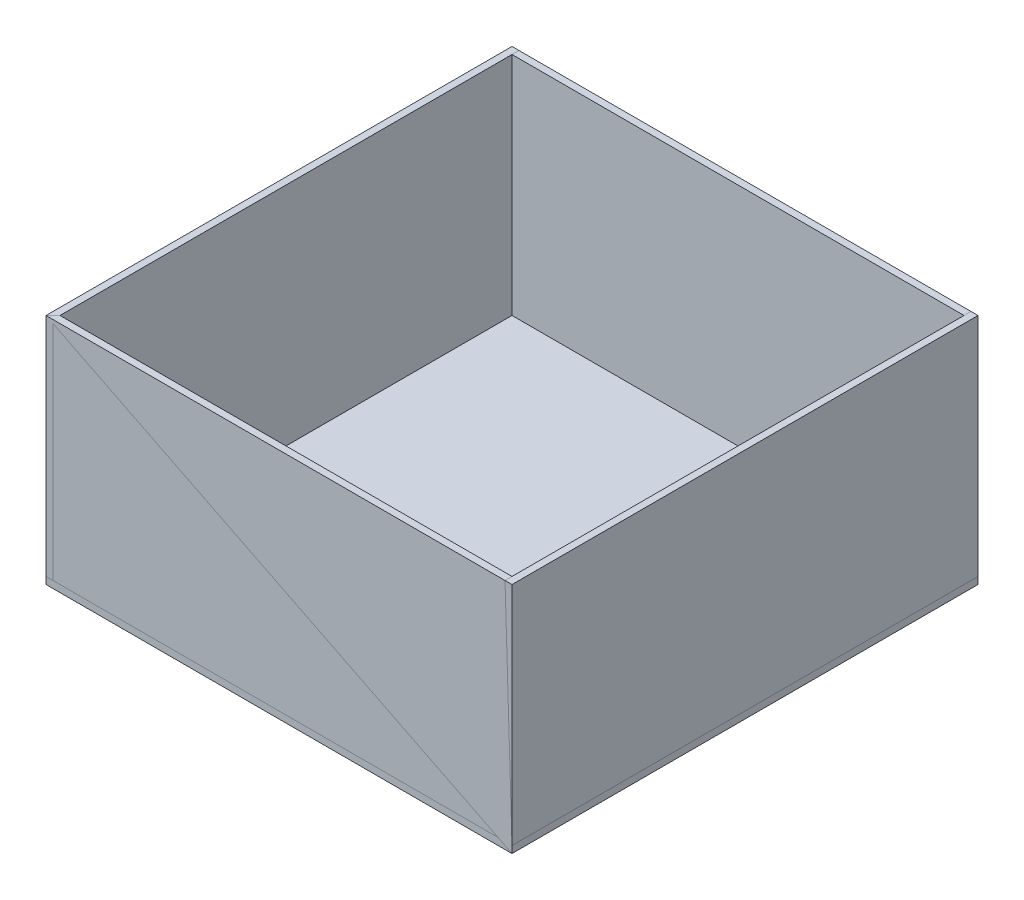
ISO-10303-21;
HEADER;
FILE_DESCRIPTION(('STEP AP214'),'2;1');
FILE_NAME('part.step','',(''),(''),'','','');
FILE_SCHEMA(('AUTOMOTIVE_DESIGN { 1 0 10303 214 1 1 1 1 }'));
ENDSEC;
DATA;
#1=APPLICATION_CONTEXT('core data for automotive mechanical design processes');
#2=APPLICATION_PROTOCOL_DEFINITION('international standard','automotive_design',2000,#1);
#3=PRODUCT_CONTEXT('',#1,'mechanical');
#4=PRODUCT('Part','Part','',(#3));
#5=PRODUCT_RELATED_PRODUCT_CATEGORY('part','',(#4));
#6=PRODUCT_DEFINITION_FORMATION('','',#4);
#7=PRODUCT_DEFINITION_CONTEXT('part definition',#1,'design');
#8=PRODUCT_DEFINITION('design','',#6,#7);
#9=PRODUCT_DEFINITION_SHAPE('','',#8);
#10=(LENGTH_UNIT() NAMED_UNIT(*) SI_UNIT(.MILLI.,.METRE.));
#11=(NAMED_UNIT(*) PLANE_ANGLE_UNIT() SI_UNIT($,.RADIAN.));
#12=(NAMED_UNIT(*) SI_UNIT($,.STERADIAN.) SOLID_ANGLE_UNIT());
#13=UNCERTAINTY_MEASURE_WITH_UNIT(LENGTH_MEASURE(1.E-05),#10,'distance_accuracy_value','');
#14=(GEOMETRIC_REPRESENTATION_CONTEXT(3) GLOBAL_UNCERTAINTY_ASSIGNED_CONTEXT((#13)) GLOBAL_UNIT_ASSIGNED_CONTEXT((#10,
#11,#12)) REPRESENTATION_CONTEXT('',''));
#15=CARTESIAN_POINT('',(0.,0.,0.));
#16=DIRECTION('',(0.,0.,1.));
#17=DIRECTION('',(1.,0.,0.));
#18=AXIS2_PLACEMENT_3D('',#15,#16,#17);
#19=CARTESIAN_POINT('',(-97.,294.023194489731,100.));
#20=DIRECTION('',(1.,0.,0.));
#21=DIRECTION('',(0.,0.,-1.));
#22=AXIS2_PLACEMENT_3D('',#19,#20,#21);
#23=PLANE('',#22);
#24=DIRECTION('',(0.,0.,1.));
#25=VECTOR('',#24,1.);
#26=CARTESIAN_POINT('',(-97.,100.,100.));
#27=LINE('',#26,#25);
#28=CARTESIAN_POINT('',(-97.,100.,97.));
#29=VERTEX_POINT('',#28);
#30=CARTESIAN_POINT('',(-97.,100.,100.));
#31=VERTEX_POINT('',#30);
#32=EDGE_CURVE('E100',#29,#31,#27,.T.);
#33=ORIENTED_EDGE('',*,*,#32,.F.);
#34=DIRECTION('',(0.,-1.,0.));
#35=VECTOR('',#34,1.);
#36=CARTESIAN_POINT('',(-97.,294.023194489731,97.));
#37=LINE('',#36,#35);
#38=CARTESIAN_POINT('',(-97.,3.,97.));
#39=VERTEX_POINT('',#38);
#40=EDGE_CURVE('E54',#29,#39,#37,.T.);
#41=ORIENTED_EDGE('',*,*,#40,.T.);
#42=DIRECTION('',(0.,0.,1.));
#43=VECTOR('',#42,1.);
#44=CARTESIAN_POINT('',(-97.,3.,100.));
#45=LINE('',#44,#43);
#46=CARTESIAN_POINT('',(-97.,3.,100.));
#47=VERTEX_POINT('',#46);
#48=EDGE_CURVE('E98',#39,#47,#45,.T.);
#49=ORIENTED_EDGE('',*,*,#48,.T.);
#50=DIRECTION('',(0.,-1.,0.));
#51=VECTOR('',#50,1.);
#52=CARTESIAN_POINT('',(-97.,294.023194489731,100.));
#53=LINE('',#52,#51);
#54=EDGE_CURVE('E89',#31,#47,#53,.T.);
#55=ORIENTED_EDGE('',*,*,#54,.F.);
#56=EDGE_LOOP('',(#33,#41,#49,#55));
#57=FACE_BOUND('',#56,.T.);
#58=ADVANCED_FACE('F50',(#57),#23,.F.);
#59=CARTESIAN_POINT('',(-97.,294.023194489731,100.));
#60=DIRECTION('',(0.,0.,-1.));
#61=DIRECTION('',(-1.,0.,0.));
#62=AXIS2_PLACEMENT_3D('',#59,#60,#61);
#63=PLANE('',#62);
#64=DIRECTION('',(1.,0.,0.));
#65=VECTOR('',#64,1.);
#66=CARTESIAN_POINT('',(-97.,100.,100.));
#67=LINE('',#66,#65);
#68=CARTESIAN_POINT('',(97.,100.,100.));
#69=VERTEX_POINT('',#68);
#70=EDGE_CURVE('E59',#31,#69,#67,.T.);
#71=ORIENTED_EDGE('',*,*,#70,.F.);
#72=ORIENTED_EDGE('',*,*,#54,.T.);
#73=DIRECTION('',(1.,0.,0.));
#74=VECTOR('',#73,1.);
#75=CARTESIAN_POINT('',(-97.,3.,100.));
#76=LINE('',#75,#74);
#77=CARTESIAN_POINT('',(97.,3.,100.));
#78=VERTEX_POINT('',#77);
#79=EDGE_CURVE('E110',#47,#78,#76,.T.);
#80=ORIENTED_EDGE('',*,*,#79,.T.);
#81=DIRECTION('',(0.,-1.,0.));
#82=VECTOR('',#81,1.);
#83=CARTESIAN_POINT('',(97.,294.023194489731,100.));
#84=LINE('',#83,#82);
#85=EDGE_CURVE('E119',#69,#78,#84,.T.);
#86=ORIENTED_EDGE('',*,*,#85,.F.);
#87=EDGE_LOOP('',(#71,#72,#80,#86));
#88=FACE_BOUND('',#87,.T.);
#89=ADVANCED_FACE('F123',(#88),#63,.F.);
#90=CARTESIAN_POINT('',(97.,294.023194489731,100.));
#91=DIRECTION('',(-1.,0.,0.));
#92=DIRECTION('',(0.,0.,1.));
#93=AXIS2_PLACEMENT_3D('',#90,#91,#92);
#94=PLANE('',#93);
#95=DIRECTION('',(0.,0.,-1.));
#96=VECTOR('',#95,1.);
#97=CARTESIAN_POINT('',(97.,100.,100.));
#98=LINE('',#97,#96);
#99=CARTESIAN_POINT('',(97.,100.,97.));
#100=VERTEX_POINT('',#99);
#101=EDGE_CURVE('E12',#69,#100,#98,.T.);
#102=ORIENTED_EDGE('',*,*,#101,.F.);
#103=ORIENTED_EDGE('',*,*,#85,.T.);
#104=DIRECTION('',(0.,0.,-1.));
#105=VECTOR('',#104,1.);
#106=CARTESIAN_POINT('',(97.,3.,100.));
#107=LINE('',#106,#105);
#108=CARTESIAN_POINT('',(97.,3.,97.));
#109=VERTEX_POINT('',#108);
#110=EDGE_CURVE('E120',#78,#109,#107,.T.);
#111=ORIENTED_EDGE('',*,*,#110,.T.);
#112=DIRECTION('',(0.,-1.,0.));
#113=VECTOR('',#112,1.);
#114=CARTESIAN_POINT('',(97.,294.023194489731,97.));
#115=LINE('',#114,#113);
#116=EDGE_CURVE('E72',#100,#109,#115,.T.);
#117=ORIENTED_EDGE('',*,*,#116,.F.);
#118=EDGE_LOOP('',(#102,#103,#111,#117));
#119=FACE_BOUND('',#118,.T.);
#120=ADVANCED_FACE('F122',(#119),#94,.F.);
#121=CARTESIAN_POINT('',(-97.,294.023194489731,97.));
#122=DIRECTION('',(0.,0.,1.));
#123=DIRECTION('',(1.,0.,0.));
#124=AXIS2_PLACEMENT_3D('',#121,#122,#123);
#125=PLANE('',#124);
#126=DIRECTION('',(-1.,0.,0.));
#127=VECTOR('',#126,1.);
#128=CARTESIAN_POINT('',(-97.,100.,97.));
#129=LINE('',#128,#127);
#130=EDGE_CURVE('E107',#100,#29,#129,.T.);
#131=ORIENTED_EDGE('',*,*,#130,.F.);
#132=ORIENTED_EDGE('',*,*,#116,.T.);
#133=DIRECTION('',(-1.,0.,0.));
#134=VECTOR('',#133,1.);
#135=CARTESIAN_POINT('',(-97.,3.,97.));
#136=LINE('',#135,#134);
#137=EDGE_CURVE('E103',#109,#39,#136,.T.);
#138=ORIENTED_EDGE('',*,*,#137,.T.);
#139=ORIENTED_EDGE('',*,*,#40,.F.);
#140=EDGE_LOOP('',(#131,#132,#138,#139));
#141=FACE_BOUND('',#140,.T.);
#142=ADVANCED_FACE('F104',(#141),#125,.F.);
#143=CARTESIAN_POINT('',(0.,3.,0.));
#144=DIRECTION('',(0.,-1.,0.));
#145=DIRECTION('',(0.,0.,-1.));
#146=AXIS2_PLACEMENT_3D('',#143,#144,#145);
#147=PLANE('',#146);
#148=ORIENTED_EDGE('',*,*,#48,.F.);
#149=ORIENTED_EDGE('',*,*,#137,.F.);
#150=ORIENTED_EDGE('',*,*,#110,.F.);
#151=ORIENTED_EDGE('',*,*,#79,.F.);
#152=EDGE_LOOP('',(#148,#149,#150,#151));
#153=FACE_BOUND('',#152,.T.);
#154=ADVANCED_FACE('F109',(#153),#147,.T.);
#155=CARTESIAN_POINT('',(0.,100.,0.));
#156=DIRECTION('',(0.,1.,0.));
#157=DIRECTION('',(0.,0.,1.));
#158=AXIS2_PLACEMENT_3D('',#155,#156,#157);
#159=PLANE('',#158);
#160=ORIENTED_EDGE('',*,*,#130,.T.);
#161=ORIENTED_EDGE('',*,*,#32,.T.);
#162=ORIENTED_EDGE('',*,*,#70,.T.);
#163=ORIENTED_EDGE('',*,*,#101,.T.);
#164=EDGE_LOOP('',(#160,#161,#162,#163));
#165=FACE_BOUND('',#164,.T.);
#166=ADVANCED_FACE('F52',(#165),#159,.T.);
#167=CLOSED_SHELL('',(#58,#89,#120,#142,#154,#166));
#168=MANIFOLD_SOLID_BREP('B2',#167);
#169=CARTESIAN_POINT('',(-97.,294.023194489731,-100.));
#170=DIRECTION('',(1.,0.,0.));
#171=DIRECTION('',(0.,0.,-1.));
#172=AXIS2_PLACEMENT_3D('',#169,#170,#171);
#173=PLANE('',#172);
#174=DIRECTION('',(0.,0.,1.));
#175=VECTOR('',#174,1.);
#176=CARTESIAN_POINT('',(-97.,100.,-100.));
#177=LINE('',#176,#175);
#178=CARTESIAN_POINT('',(-97.,100.,-100.));
#179=VERTEX_POINT('',#178);
#180=CARTESIAN_POINT('',(-97.,100.,-97.));
#181=VERTEX_POINT('',#180);
#182=EDGE_CURVE('E234',#179,#181,#177,.T.);
#183=ORIENTED_EDGE('',*,*,#182,.F.);
#184=DIRECTION('',(0.,-1.,0.));
#185=VECTOR('',#184,1.);
#186=CARTESIAN_POINT('',(-97.,294.023194489731,-100.));
#187=LINE('',#186,#185);
#188=CARTESIAN_POINT('',(-97.,3.,-100.));
#189=VERTEX_POINT('',#188);
#190=EDGE_CURVE('E188',#179,#189,#187,.T.);
#191=ORIENTED_EDGE('',*,*,#190,.T.);
#192=DIRECTION('',(0.,0.,1.));
#193=VECTOR('',#192,1.);
#194=CARTESIAN_POINT('',(-97.,3.,-100.));
#195=LINE('',#194,#193);
#196=CARTESIAN_POINT('',(-97.,3.,-97.));
#197=VERTEX_POINT('',#196);
#198=EDGE_CURVE('E232',#189,#197,#195,.T.);
#199=ORIENTED_EDGE('',*,*,#198,.T.);
#200=DIRECTION('',(0.,-1.,0.));
#201=VECTOR('',#200,1.);
#202=CARTESIAN_POINT('',(-97.,294.023194489731,-97.));
#203=LINE('',#202,#201);
#204=EDGE_CURVE('E223',#181,#197,#203,.T.);
#205=ORIENTED_EDGE('',*,*,#204,.F.);
#206=EDGE_LOOP('',(#183,#191,#199,#205));
#207=FACE_BOUND('',#206,.T.);
#208=ADVANCED_FACE('F184',(#207),#173,.F.);
#209=CARTESIAN_POINT('',(-97.,294.023194489731,-97.));
#210=DIRECTION('',(0.,0.,-1.));
#211=DIRECTION('',(-1.,0.,0.));
#212=AXIS2_PLACEMENT_3D('',#209,#210,#211);
#213=PLANE('',#212);
#214=DIRECTION('',(1.,0.,0.));
#215=VECTOR('',#214,1.);
#216=CARTESIAN_POINT('',(-97.,100.,-97.));
#217=LINE('',#216,#215);
#218=CARTESIAN_POINT('',(97.,100.,-97.));
#219=VERTEX_POINT('',#218);
#220=EDGE_CURVE('E193',#181,#219,#217,.T.);
#221=ORIENTED_EDGE('',*,*,#220,.F.);
#222=ORIENTED_EDGE('',*,*,#204,.T.);
#223=DIRECTION('',(1.,0.,0.));
#224=VECTOR('',#223,1.);
#225=CARTESIAN_POINT('',(-97.,3.,-97.));
#226=LINE('',#225,#224);
#227=CARTESIAN_POINT('',(97.,3.,-97.));
#228=VERTEX_POINT('',#227);
#229=EDGE_CURVE('E244',#197,#228,#226,.T.);
#230=ORIENTED_EDGE('',*,*,#229,.T.);
#231=DIRECTION('',(0.,-1.,0.));
#232=VECTOR('',#231,1.);
#233=CARTESIAN_POINT('',(97.,294.023194489731,-97.));
#234=LINE('',#233,#232);
#235=EDGE_CURVE('E253',#219,#228,#234,.T.);
#236=ORIENTED_EDGE('',*,*,#235,.F.);
#237=EDGE_LOOP('',(#221,#222,#230,#236));
#238=FACE_BOUND('',#237,.T.);
#239=ADVANCED_FACE('F257',(#238),#213,.F.);
#240=CARTESIAN_POINT('',(97.,294.023194489731,-100.));
#241=DIRECTION('',(-1.,0.,0.));
#242=DIRECTION('',(0.,0.,1.));
#243=AXIS2_PLACEMENT_3D('',#240,#241,#242);
#244=PLANE('',#243);
#245=DIRECTION('',(0.,0.,-1.));
#246=VECTOR('',#245,1.);
#247=CARTESIAN_POINT('',(97.,100.,-100.));
#248=LINE('',#247,#246);
#249=CARTESIAN_POINT('',(97.,100.,-100.));
#250=VERTEX_POINT('',#249);
#251=EDGE_CURVE('E48',#219,#250,#248,.T.);
#252=ORIENTED_EDGE('',*,*,#251,.F.);
#253=ORIENTED_EDGE('',*,*,#235,.T.);
#254=DIRECTION('',(0.,0.,-1.));
#255=VECTOR('',#254,1.);
#256=CARTESIAN_POINT('',(97.,3.,-100.));
#257=LINE('',#256,#255);
#258=CARTESIAN_POINT('',(97.,3.,-100.));
#259=VERTEX_POINT('',#258);
#260=EDGE_CURVE('E254',#228,#259,#257,.T.);
#261=ORIENTED_EDGE('',*,*,#260,.T.);
#262=DIRECTION('',(0.,-1.,0.));
#263=VECTOR('',#262,1.);
#264=CARTESIAN_POINT('',(97.,294.023194489731,-100.));
#265=LINE('',#264,#263);
#266=EDGE_CURVE('E206',#250,#259,#265,.T.);
#267=ORIENTED_EDGE('',*,*,#266,.F.);
#268=EDGE_LOOP('',(#252,#253,#261,#267));
#269=FACE_BOUND('',#268,.T.);
#270=ADVANCED_FACE('F256',(#269),#244,.F.);
#271=CARTESIAN_POINT('',(-97.,294.023194489731,-100.));
#272=DIRECTION('',(0.,0.,1.));
#273=DIRECTION('',(1.,0.,0.));
#274=AXIS2_PLACEMENT_3D('',#271,#272,#273);
#275=PLANE('',#274);
#276=DIRECTION('',(-1.,0.,0.));
#277=VECTOR('',#276,1.);
#278=CARTESIAN_POINT('',(-97.,100.,-100.));
#279=LINE('',#278,#277);
#280=EDGE_CURVE('E241',#250,#179,#279,.T.);
#281=ORIENTED_EDGE('',*,*,#280,.F.);
#282=ORIENTED_EDGE('',*,*,#266,.T.);
#283=DIRECTION('',(-1.,0.,0.));
#284=VECTOR('',#283,1.);
#285=CARTESIAN_POINT('',(-97.,3.,-100.));
#286=LINE('',#285,#284);
#287=EDGE_CURVE('E237',#259,#189,#286,.T.);
#288=ORIENTED_EDGE('',*,*,#287,.T.);
#289=ORIENTED_EDGE('',*,*,#190,.F.);
#290=EDGE_LOOP('',(#281,#282,#288,#289));
#291=FACE_BOUND('',#290,.T.);
#292=ADVANCED_FACE('F238',(#291),#275,.F.);
#293=CARTESIAN_POINT('',(0.,3.,0.));
#294=DIRECTION('',(0.,1.,0.));
#295=DIRECTION('',(0.,0.,1.));
#296=AXIS2_PLACEMENT_3D('',#293,#294,#295);
#297=PLANE('',#296);
#298=ORIENTED_EDGE('',*,*,#198,.F.);
#299=ORIENTED_EDGE('',*,*,#287,.F.);
#300=ORIENTED_EDGE('',*,*,#260,.F.);
#301=ORIENTED_EDGE('',*,*,#229,.F.);
#302=EDGE_LOOP('',(#298,#299,#300,#301));
#303=FACE_BOUND('',#302,.T.);
#304=ADVANCED_FACE('F243',(#303),#297,.F.);
#305=CARTESIAN_POINT('',(0.,100.,0.));
#306=DIRECTION('',(0.,1.,0.));
#307=DIRECTION('',(0.,0.,1.));
#308=AXIS2_PLACEMENT_3D('',#305,#306,#307);
#309=PLANE('',#308);
#310=ORIENTED_EDGE('',*,*,#280,.T.);
#311=ORIENTED_EDGE('',*,*,#182,.T.);
#312=ORIENTED_EDGE('',*,*,#220,.T.);
#313=ORIENTED_EDGE('',*,*,#251,.T.);
#314=EDGE_LOOP('',(#310,#311,#312,#313));
#315=FACE_BOUND('',#314,.T.);
#316=ADVANCED_FACE('F186',(#315),#309,.T.);
#317=CLOSED_SHELL('',(#208,#239,#270,#292,#304,#316));
#318=MANIFOLD_SOLID_BREP('B6',#317);
#319=CARTESIAN_POINT('',(100.,300.022498734517,-100.));
#320=DIRECTION('',(-1.,0.,0.));
#321=DIRECTION('',(0.,0.,1.));
#322=AXIS2_PLACEMENT_3D('',#319,#320,#321);
#323=PLANE('',#322);
#324=DIRECTION('',(0.,0.,-1.));
#325=VECTOR('',#324,1.);
#326=CARTESIAN_POINT('',(100.,100.,-100.));
#327=LINE('',#326,#325);
#328=CARTESIAN_POINT('',(100.,100.,100.));
#329=VERTEX_POINT('',#328);
#330=CARTESIAN_POINT('',(100.,100.,-100.));
#331=VERTEX_POINT('',#330);
#332=EDGE_CURVE('E368',#329,#331,#327,.T.);
#333=ORIENTED_EDGE('',*,*,#332,.F.);
#334=DIRECTION('',(0.,-1.,0.));
#335=VECTOR('',#334,1.);
#336=CARTESIAN_POINT('',(100.,300.022498734517,100.));
#337=LINE('',#336,#335);
#338=CARTESIAN_POINT('',(100.,3.,100.));
#339=VERTEX_POINT('',#338);
#340=EDGE_CURVE('E322',#329,#339,#337,.T.);
#341=ORIENTED_EDGE('',*,*,#340,.T.);
#342=DIRECTION('',(0.,0.,-1.));
#343=VECTOR('',#342,1.);
#344=CARTESIAN_POINT('',(100.,3.,-100.));
#345=LINE('',#344,#343);
#346=CARTESIAN_POINT('',(100.,3.,-100.));
#347=VERTEX_POINT('',#346);
#348=EDGE_CURVE('E366',#339,#347,#345,.T.);
#349=ORIENTED_EDGE('',*,*,#348,.T.);
#350=DIRECTION('',(0.,-1.,0.));
#351=VECTOR('',#350,1.);
#352=CARTESIAN_POINT('',(100.,300.022498734517,-100.));
#353=LINE('',#352,#351);
#354=EDGE_CURVE('E357',#331,#347,#353,.T.);
#355=ORIENTED_EDGE('',*,*,#354,.F.);
#356=EDGE_LOOP('',(#333,#341,#349,#355));
#357=FACE_BOUND('',#356,.T.);
#358=ADVANCED_FACE('F318',(#357),#323,.F.);
#359=CARTESIAN_POINT('',(100.,300.022498734517,-100.));
#360=DIRECTION('',(0.,0.,1.));
#361=DIRECTION('',(1.,0.,0.));
#362=AXIS2_PLACEMENT_3D('',#359,#360,#361);
#363=PLANE('',#362);
#364=DIRECTION('',(-1.,0.,0.));
#365=VECTOR('',#364,1.);
#366=CARTESIAN_POINT('',(100.,100.,-100.));
#367=LINE('',#366,#365);
#368=CARTESIAN_POINT('',(97.,100.,-100.));
#369=VERTEX_POINT('',#368);
#370=EDGE_CURVE('E327',#331,#369,#367,.T.);
#371=ORIENTED_EDGE('',*,*,#370,.F.);
#372=ORIENTED_EDGE('',*,*,#354,.T.);
#373=DIRECTION('',(-1.,0.,0.));
#374=VECTOR('',#373,1.);
#375=CARTESIAN_POINT('',(100.,3.,-100.));
#376=LINE('',#375,#374);
#377=CARTESIAN_POINT('',(97.,3.,-100.));
#378=VERTEX_POINT('',#377);
#379=EDGE_CURVE('E378',#347,#378,#376,.T.);
#380=ORIENTED_EDGE('',*,*,#379,.T.);
#381=DIRECTION('',(0.,-1.,0.));
#382=VECTOR('',#381,1.);
#383=CARTESIAN_POINT('',(97.,300.022498734517,-100.));
#384=LINE('',#383,#382);
#385=EDGE_CURVE('E387',#369,#378,#384,.T.);
#386=ORIENTED_EDGE('',*,*,#385,.F.);
#387=EDGE_LOOP('',(#371,#372,#380,#386));
#388=FACE_BOUND('',#387,.T.);
#389=ADVANCED_FACE('F391',(#388),#363,.F.);
#390=CARTESIAN_POINT('',(97.,300.022498734517,-100.));
#391=DIRECTION('',(1.,0.,0.));
#392=DIRECTION('',(0.,0.,-1.));
#393=AXIS2_PLACEMENT_3D('',#390,#391,#392);
#394=PLANE('',#393);
#395=DIRECTION('',(0.,0.,1.));
#396=VECTOR('',#395,1.);
#397=CARTESIAN_POINT('',(97.,100.,-100.));
#398=LINE('',#397,#396);
#399=CARTESIAN_POINT('',(97.,100.,100.));
#400=VERTEX_POINT('',#399);
#401=EDGE_CURVE('E182',#369,#400,#398,.T.);
#402=ORIENTED_EDGE('',*,*,#401,.F.);
#403=ORIENTED_EDGE('',*,*,#385,.T.);
#404=DIRECTION('',(0.,0.,1.));
#405=VECTOR('',#404,1.);
#406=CARTESIAN_POINT('',(97.,3.,-100.));
#407=LINE('',#406,#405);
#408=CARTESIAN_POINT('',(97.,3.,100.));
#409=VERTEX_POINT('',#408);
#410=EDGE_CURVE('E388',#378,#409,#407,.T.);
#411=ORIENTED_EDGE('',*,*,#410,.T.);
#412=DIRECTION('',(0.,-1.,0.));
#413=VECTOR('',#412,1.);
#414=CARTESIAN_POINT('',(97.,300.022498734517,100.));
#415=LINE('',#414,#413);
#416=EDGE_CURVE('E340',#400,#409,#415,.T.);
#417=ORIENTED_EDGE('',*,*,#416,.F.);
#418=EDGE_LOOP('',(#402,#403,#411,#417));
#419=FACE_BOUND('',#418,.T.);
#420=ADVANCED_FACE('F390',(#419),#394,.F.);
#421=CARTESIAN_POINT('',(100.,300.022498734517,100.));
#422=DIRECTION('',(0.,0.,-1.));
#423=DIRECTION('',(-1.,0.,0.));
#424=AXIS2_PLACEMENT_3D('',#421,#422,#423);
#425=PLANE('',#424);
#426=DIRECTION('',(1.,0.,0.));
#427=VECTOR('',#426,1.);
#428=CARTESIAN_POINT('',(100.,100.,100.));
#429=LINE('',#428,#427);
#430=EDGE_CURVE('E375',#400,#329,#429,.T.);
#431=ORIENTED_EDGE('',*,*,#430,.F.);
#432=ORIENTED_EDGE('',*,*,#416,.T.);
#433=DIRECTION('',(1.,0.,0.));
#434=VECTOR('',#433,1.);
#435=CARTESIAN_POINT('',(100.,3.,100.));
#436=LINE('',#435,#434);
#437=EDGE_CURVE('E371',#409,#339,#436,.T.);
#438=ORIENTED_EDGE('',*,*,#437,.T.);
#439=ORIENTED_EDGE('',*,*,#340,.F.);
#440=EDGE_LOOP('',(#431,#432,#438,#439));
#441=FACE_BOUND('',#440,.T.);
#442=ADVANCED_FACE('F372',(#441),#425,.F.);
#443=CARTESIAN_POINT('',(0.,3.,0.));
#444=DIRECTION('',(0.,-1.,0.));
#445=DIRECTION('',(0.,0.,-1.));
#446=AXIS2_PLACEMENT_3D('',#443,#444,#445);
#447=PLANE('',#446);
#448=ORIENTED_EDGE('',*,*,#348,.F.);
#449=ORIENTED_EDGE('',*,*,#437,.F.);
#450=ORIENTED_EDGE('',*,*,#410,.F.);
#451=ORIENTED_EDGE('',*,*,#379,.F.);
#452=EDGE_LOOP('',(#448,#449,#450,#451));
#453=FACE_BOUND('',#452,.T.);
#454=ADVANCED_FACE('F377',(#453),#447,.T.);
#455=CARTESIAN_POINT('',(0.,100.,0.));
#456=DIRECTION('',(0.,1.,0.));
#457=DIRECTION('',(0.,0.,1.));
#458=AXIS2_PLACEMENT_3D('',#455,#456,#457);
#459=PLANE('',#458);
#460=ORIENTED_EDGE('',*,*,#430,.T.);
#461=ORIENTED_EDGE('',*,*,#332,.T.);
#462=ORIENTED_EDGE('',*,*,#370,.T.);
#463=ORIENTED_EDGE('',*,*,#401,.T.);
#464=EDGE_LOOP('',(#460,#461,#462,#463));
#465=FACE_BOUND('',#464,.T.);
#466=ADVANCED_FACE('F320',(#465),#459,.T.);
#467=CLOSED_SHELL('',(#358,#389,#420,#442,#454,#466));
#468=MANIFOLD_SOLID_BREP('B42',#467);
#469=CARTESIAN_POINT('',(-100.,300.022498734517,-100.));
#470=DIRECTION('',(1.,0.,0.));
#471=DIRECTION('',(0.,0.,-1.));
#472=AXIS2_PLACEMENT_3D('',#469,#470,#471);
#473=PLANE('',#472);
#474=DIRECTION('',(0.,0.,1.));
#475=VECTOR('',#474,1.);
#476=CARTESIAN_POINT('',(-100.,100.,-100.));
#477=LINE('',#476,#475);
#478=CARTESIAN_POINT('',(-100.,100.,-100.));
#479=VERTEX_POINT('',#478);
#480=CARTESIAN_POINT('',(-100.,100.,100.));
#481=VERTEX_POINT('',#480);
#482=EDGE_CURVE('E502',#479,#481,#477,.T.);
#483=ORIENTED_EDGE('',*,*,#482,.F.);
#484=DIRECTION('',(0.,-1.,0.));
#485=VECTOR('',#484,1.);
#486=CARTESIAN_POINT('',(-100.,300.022498734517,-100.));
#487=LINE('',#486,#485);
#488=CARTESIAN_POINT('',(-100.,3.,-100.));
#489=VERTEX_POINT('',#488);
#490=EDGE_CURVE('E456',#479,#489,#487,.T.);
#491=ORIENTED_EDGE('',*,*,#490,.T.);
#492=DIRECTION('',(0.,0.,1.));
#493=VECTOR('',#492,1.);
#494=CARTESIAN_POINT('',(-100.,3.,-100.));
#495=LINE('',#494,#493);
#496=CARTESIAN_POINT('',(-100.,3.,100.));
#497=VERTEX_POINT('',#496);
#498=EDGE_CURVE('E500',#489,#497,#495,.T.);
#499=ORIENTED_EDGE('',*,*,#498,.T.);
#500=DIRECTION('',(0.,-1.,0.));
#501=VECTOR('',#500,1.);
#502=CARTESIAN_POINT('',(-100.,300.022498734517,100.));
#503=LINE('',#502,#501);
#504=EDGE_CURVE('E491',#481,#497,#503,.T.);
#505=ORIENTED_EDGE('',*,*,#504,.F.);
#506=EDGE_LOOP('',(#483,#491,#499,#505));
#507=FACE_BOUND('',#506,.T.);
#508=ADVANCED_FACE('F452',(#507),#473,.F.);
#509=CARTESIAN_POINT('',(-100.,300.022498734517,100.));
#510=DIRECTION('',(0.,0.,-1.));
#511=DIRECTION('',(-1.,0.,0.));
#512=AXIS2_PLACEMENT_3D('',#509,#510,#511);
#513=PLANE('',#512);
#514=DIRECTION('',(1.,0.,0.));
#515=VECTOR('',#514,1.);
#516=CARTESIAN_POINT('',(-100.,100.,100.));
#517=LINE('',#516,#515);
#518=CARTESIAN_POINT('',(-97.,100.,100.));
#519=VERTEX_POINT('',#518);
#520=EDGE_CURVE('E461',#481,#519,#517,.T.);
#521=ORIENTED_EDGE('',*,*,#520,.F.);
#522=ORIENTED_EDGE('',*,*,#504,.T.);
#523=DIRECTION('',(1.,0.,0.));
#524=VECTOR('',#523,1.);
#525=CARTESIAN_POINT('',(-100.,3.,100.));
#526=LINE('',#525,#524);
#527=CARTESIAN_POINT('',(-97.,3.,100.));
#528=VERTEX_POINT('',#527);
#529=EDGE_CURVE('E512',#497,#528,#526,.T.);
#530=ORIENTED_EDGE('',*,*,#529,.T.);
#531=DIRECTION('',(0.,-1.,0.));
#532=VECTOR('',#531,1.);
#533=CARTESIAN_POINT('',(-97.,300.022498734517,100.));
#534=LINE('',#533,#532);
#535=EDGE_CURVE('E521',#519,#528,#534,.T.);
#536=ORIENTED_EDGE('',*,*,#535,.F.);
#537=EDGE_LOOP('',(#521,#522,#530,#536));
#538=FACE_BOUND('',#537,.T.);
#539=ADVANCED_FACE('F525',(#538),#513,.F.);
#540=CARTESIAN_POINT('',(-97.,300.022498734517,-100.));
#541=DIRECTION('',(-1.,0.,0.));
#542=DIRECTION('',(0.,0.,1.));
#543=AXIS2_PLACEMENT_3D('',#540,#541,#542);
#544=PLANE('',#543);
#545=DIRECTION('',(0.,0.,-1.));
#546=VECTOR('',#545,1.);
#547=CARTESIAN_POINT('',(-97.,100.,-100.));
#548=LINE('',#547,#546);
#549=CARTESIAN_POINT('',(-97.,100.,-100.));
#550=VERTEX_POINT('',#549);
#551=EDGE_CURVE('E316',#519,#550,#548,.T.);
#552=ORIENTED_EDGE('',*,*,#551,.F.);
#553=ORIENTED_EDGE('',*,*,#535,.T.);
#554=DIRECTION('',(0.,0.,-1.));
#555=VECTOR('',#554,1.);
#556=CARTESIAN_POINT('',(-97.,3.,-100.));
#557=LINE('',#556,#555);
#558=CARTESIAN_POINT('',(-97.,3.,-100.));
#559=VERTEX_POINT('',#558);
#560=EDGE_CURVE('E522',#528,#559,#557,.T.);
#561=ORIENTED_EDGE('',*,*,#560,.T.);
#562=DIRECTION('',(0.,-1.,0.));
#563=VECTOR('',#562,1.);
#564=CARTESIAN_POINT('',(-97.,300.022498734517,-100.));
#565=LINE('',#564,#563);
#566=EDGE_CURVE('E474',#550,#559,#565,.T.);
#567=ORIENTED_EDGE('',*,*,#566,.F.);
#568=EDGE_LOOP('',(#552,#553,#561,#567));
#569=FACE_BOUND('',#568,.T.);
#570=ADVANCED_FACE('F524',(#569),#544,.F.);
#571=CARTESIAN_POINT('',(-100.,300.022498734517,-100.));
#572=DIRECTION('',(0.,0.,1.));
#573=DIRECTION('',(1.,0.,0.));
#574=AXIS2_PLACEMENT_3D('',#571,#572,#573);
#575=PLANE('',#574);
#576=DIRECTION('',(-1.,0.,0.));
#577=VECTOR('',#576,1.);
#578=CARTESIAN_POINT('',(-100.,100.,-100.));
#579=LINE('',#578,#577);
#580=EDGE_CURVE('E509',#550,#479,#579,.T.);
#581=ORIENTED_EDGE('',*,*,#580,.F.);
#582=ORIENTED_EDGE('',*,*,#566,.T.);
#583=DIRECTION('',(-1.,0.,0.));
#584=VECTOR('',#583,1.);
#585=CARTESIAN_POINT('',(-100.,3.,-100.));
#586=LINE('',#585,#584);
#587=EDGE_CURVE('E505',#559,#489,#586,.T.);
#588=ORIENTED_EDGE('',*,*,#587,.T.);
#589=ORIENTED_EDGE('',*,*,#490,.F.);
#590=EDGE_LOOP('',(#581,#582,#588,#589));
#591=FACE_BOUND('',#590,.T.);
#592=ADVANCED_FACE('F506',(#591),#575,.F.);
#593=CARTESIAN_POINT('',(0.,3.,0.));
#594=DIRECTION('',(0.,1.,0.));
#595=DIRECTION('',(0.,0.,1.));
#596=AXIS2_PLACEMENT_3D('',#593,#594,#595);
#597=PLANE('',#596);
#598=ORIENTED_EDGE('',*,*,#498,.F.);
#599=ORIENTED_EDGE('',*,*,#587,.F.);
#600=ORIENTED_EDGE('',*,*,#560,.F.);
#601=ORIENTED_EDGE('',*,*,#529,.F.);
#602=EDGE_LOOP('',(#598,#599,#600,#601));
#603=FACE_BOUND('',#602,.T.);
#604=ADVANCED_FACE('F511',(#603),#597,.F.);
#605=CARTESIAN_POINT('',(0.,100.,0.));
#606=DIRECTION('',(0.,1.,0.));
#607=DIRECTION('',(0.,0.,1.));
#608=AXIS2_PLACEMENT_3D('',#605,#606,#607);
#609=PLANE('',#608);
#610=ORIENTED_EDGE('',*,*,#580,.T.);
#611=ORIENTED_EDGE('',*,*,#482,.T.);
#612=ORIENTED_EDGE('',*,*,#520,.T.);
#613=ORIENTED_EDGE('',*,*,#551,.T.);
#614=EDGE_LOOP('',(#610,#611,#612,#613));
#615=FACE_BOUND('',#614,.T.);
#616=ADVANCED_FACE('F454',(#615),#609,.T.);
#617=CLOSED_SHELL('',(#508,#539,#570,#592,#604,#616));
#618=MANIFOLD_SOLID_BREP('B176',#617);
#619=CARTESIAN_POINT('',(0.,3.,0.));
#620=DIRECTION('',(0.,1.,0.));
#621=DIRECTION('',(0.,0.,1.));
#622=AXIS2_PLACEMENT_3D('',#619,#620,#621);
#623=PLANE('',#622);
#624=DIRECTION('',(0.,0.,-1.));
#625=VECTOR('',#624,1.);
#626=CARTESIAN_POINT('',(-100.,3.,100.));
#627=LINE('',#626,#625);
#628=CARTESIAN_POINT('',(-100.,3.,100.));
#629=VERTEX_POINT('',#628);
#630=CARTESIAN_POINT('',(-100.,3.,-100.));
#631=VERTEX_POINT('',#630);
#632=EDGE_CURVE('E593',#629,#631,#627,.T.);
#633=ORIENTED_EDGE('',*,*,#632,.F.);
#634=DIRECTION('',(-1.,0.,0.));
#635=VECTOR('',#634,1.);
#636=CARTESIAN_POINT('',(100.,3.,100.));
#637=LINE('',#636,#635);
#638=CARTESIAN_POINT('',(100.,3.,100.));
#639=VERTEX_POINT('',#638);
#640=EDGE_CURVE('E616',#639,#629,#637,.T.);
#641=ORIENTED_EDGE('',*,*,#640,.F.);
#642=DIRECTION('',(0.,0.,1.));
#643=VECTOR('',#642,1.);
#644=CARTESIAN_POINT('',(100.,3.,-100.));
#645=LINE('',#644,#643);
#646=CARTESIAN_POINT('',(100.,3.,-100.));
#647=VERTEX_POINT('',#646);
#648=EDGE_CURVE('E621',#647,#639,#645,.T.);
#649=ORIENTED_EDGE('',*,*,#648,.F.);
#650=DIRECTION('',(1.,0.,0.));
#651=VECTOR('',#650,1.);
#652=CARTESIAN_POINT('',(-100.,3.,-100.));
#653=LINE('',#652,#651);
#654=EDGE_CURVE('E636',#631,#647,#653,.T.);
#655=ORIENTED_EDGE('',*,*,#654,.F.);
#656=EDGE_LOOP('',(#633,#641,#649,#655));
#657=FACE_BOUND('',#656,.T.);
#658=ADVANCED_FACE('F585',(#657),#623,.T.);
#659=CARTESIAN_POINT('',(0.,0.,0.));
#660=DIRECTION('',(0.,-1.,0.));
#661=DIRECTION('',(0.,0.,-1.));
#662=AXIS2_PLACEMENT_3D('',#659,#660,#661);
#663=PLANE('',#662);
#664=DIRECTION('',(0.,0.,-1.));
#665=VECTOR('',#664,1.);
#666=CARTESIAN_POINT('',(-100.,0.,100.));
#667=LINE('',#666,#665);
#668=CARTESIAN_POINT('',(-100.,0.,100.));
#669=VERTEX_POINT('',#668);
#670=CARTESIAN_POINT('',(-100.,0.,-100.));
#671=VERTEX_POINT('',#670);
#672=EDGE_CURVE('E645',#669,#671,#667,.T.);
#673=ORIENTED_EDGE('',*,*,#672,.T.);
#674=DIRECTION('',(1.,0.,0.));
#675=VECTOR('',#674,1.);
#676=CARTESIAN_POINT('',(-100.,0.,-100.));
#677=LINE('',#676,#675);
#678=CARTESIAN_POINT('',(100.,0.,-100.));
#679=VERTEX_POINT('',#678);
#680=EDGE_CURVE('E634',#671,#679,#677,.T.);
#681=ORIENTED_EDGE('',*,*,#680,.T.);
#682=DIRECTION('',(0.,0.,1.));
#683=VECTOR('',#682,1.);
#684=CARTESIAN_POINT('',(100.,0.,-100.));
#685=LINE('',#684,#683);
#686=CARTESIAN_POINT('',(100.,0.,100.));
#687=VERTEX_POINT('',#686);
#688=EDGE_CURVE('E637',#679,#687,#685,.T.);
#689=ORIENTED_EDGE('',*,*,#688,.T.);
#690=DIRECTION('',(-1.,0.,0.));
#691=VECTOR('',#690,1.);
#692=CARTESIAN_POINT('',(100.,0.,100.));
#693=LINE('',#692,#691);
#694=EDGE_CURVE('E642',#687,#669,#693,.T.);
#695=ORIENTED_EDGE('',*,*,#694,.T.);
#696=EDGE_LOOP('',(#673,#681,#689,#695));
#697=FACE_BOUND('',#696,.T.);
#698=ADVANCED_FACE('F644',(#697),#663,.T.);
#699=CARTESIAN_POINT('',(-100.,285.842712474619,-100.));
#700=DIRECTION('',(0.,0.,-1.));
#701=DIRECTION('',(-1.,0.,0.));
#702=AXIS2_PLACEMENT_3D('',#699,#700,#701);
#703=PLANE('',#702);
#704=DIRECTION('',(0.,-1.,0.));
#705=VECTOR('',#704,1.);
#706=CARTESIAN_POINT('',(-100.,285.842712474619,-100.));
#707=LINE('',#706,#705);
#708=EDGE_CURVE('E450',#631,#671,#707,.T.);
#709=ORIENTED_EDGE('',*,*,#708,.F.);
#710=ORIENTED_EDGE('',*,*,#654,.T.);
#711=DIRECTION('',(0.,-1.,0.));
#712=VECTOR('',#711,1.);
#713=CARTESIAN_POINT('',(100.,285.842712474619,-100.));
#714=LINE('',#713,#712);
#715=EDGE_CURVE('E631',#647,#679,#714,.T.);
#716=ORIENTED_EDGE('',*,*,#715,.T.);
#717=ORIENTED_EDGE('',*,*,#680,.F.);
#718=EDGE_LOOP('',(#709,#710,#716,#717));
#719=FACE_BOUND('',#718,.T.);
#720=ADVANCED_FACE('F632',(#719),#703,.T.);
#721=CARTESIAN_POINT('',(100.,285.842712474619,-100.));
#722=DIRECTION('',(1.,0.,0.));
#723=DIRECTION('',(0.,0.,-1.));
#724=AXIS2_PLACEMENT_3D('',#721,#722,#723);
#725=PLANE('',#724);
#726=ORIENTED_EDGE('',*,*,#715,.F.);
#727=ORIENTED_EDGE('',*,*,#648,.T.);
#728=DIRECTION('',(0.,-1.,0.));
#729=VECTOR('',#728,1.);
#730=CARTESIAN_POINT('',(100.,285.842712474619,100.));
#731=LINE('',#730,#729);
#732=EDGE_CURVE('E626',#639,#687,#731,.T.);
#733=ORIENTED_EDGE('',*,*,#732,.T.);
#734=ORIENTED_EDGE('',*,*,#688,.F.);
#735=EDGE_LOOP('',(#726,#727,#733,#734));
#736=FACE_BOUND('',#735,.T.);
#737=ADVANCED_FACE('F638',(#736),#725,.T.);
#738=CARTESIAN_POINT('',(100.,285.842712474619,100.));
#739=DIRECTION('',(0.,0.,1.));
#740=DIRECTION('',(1.,0.,0.));
#741=AXIS2_PLACEMENT_3D('',#738,#739,#740);
#742=PLANE('',#741);
#743=ORIENTED_EDGE('',*,*,#732,.F.);
#744=ORIENTED_EDGE('',*,*,#640,.T.);
#745=DIRECTION('',(0.,-1.,0.));
#746=VECTOR('',#745,1.);
#747=CARTESIAN_POINT('',(-100.,285.842712474619,100.));
#748=LINE('',#747,#746);
#749=EDGE_CURVE('E652',#629,#669,#748,.T.);
#750=ORIENTED_EDGE('',*,*,#749,.T.);
#751=ORIENTED_EDGE('',*,*,#694,.F.);
#752=EDGE_LOOP('',(#743,#744,#750,#751));
#753=FACE_BOUND('',#752,.T.);
#754=ADVANCED_FACE('F658',(#753),#742,.T.);
#755=CARTESIAN_POINT('',(-100.,285.842712474619,100.));
#756=DIRECTION('',(-1.,0.,0.));
#757=DIRECTION('',(0.,0.,1.));
#758=AXIS2_PLACEMENT_3D('',#755,#756,#757);
#759=PLANE('',#758);
#760=ORIENTED_EDGE('',*,*,#749,.F.);
#761=ORIENTED_EDGE('',*,*,#632,.T.);
#762=ORIENTED_EDGE('',*,*,#708,.T.);
#763=ORIENTED_EDGE('',*,*,#672,.F.);
#764=EDGE_LOOP('',(#760,#761,#762,#763));
#765=FACE_BOUND('',#764,.T.);
#766=ADVANCED_FACE('F659',(#765),#759,.T.);
#767=CLOSED_SHELL('',(#658,#698,#720,#737,#754,#766));
#768=MANIFOLD_SOLID_BREP('B310',#767);
#769=CARTESIAN_POINT('',(100.,100.,-100.));
#770=DIRECTION('',(0.,0.,1.));
#771=DIRECTION('',(1.,0.,0.));
#772=AXIS2_PLACEMENT_3D('',#769,#770,#771);
#773=PLANE('',#772);
#774=DIRECTION('',(-1.,0.,0.));
#775=VECTOR('',#774,1.);
#776=CARTESIAN_POINT('',(100.,0.,-100.));
#777=LINE('',#776,#775);
#778=CARTESIAN_POINT('',(100.,0.,-100.));
#779=VERTEX_POINT('',#778);
#780=CARTESIAN_POINT('',(-100.,0.,-100.));
#781=VERTEX_POINT('',#780);
#782=EDGE_CURVE('E817',#779,#781,#777,.T.);
#783=ORIENTED_EDGE('',*,*,#782,.T.);
#784=DIRECTION('',(0.,-1.,0.));
#785=VECTOR('',#784,1.);
#786=CARTESIAN_POINT('',(-100.,100.,-100.));
#787=LINE('',#786,#785);
#788=CARTESIAN_POINT('',(-100.,100.,-100.));
#789=VERTEX_POINT('',#788);
#790=EDGE_CURVE('E583',#789,#781,#787,.T.);
#791=ORIENTED_EDGE('',*,*,#790,.F.);
#792=DIRECTION('',(-1.,0.,0.));
#793=VECTOR('',#792,1.);
#794=CARTESIAN_POINT('',(100.,100.,-100.));
#795=LINE('',#794,#793);
#796=CARTESIAN_POINT('',(100.,100.,-100.));
#797=VERTEX_POINT('',#796);
#798=EDGE_CURVE('E821',#797,#789,#795,.T.);
#799=ORIENTED_EDGE('',*,*,#798,.F.);
#800=DIRECTION('',(0.,-1.,0.));
#801=VECTOR('',#800,1.);
#802=CARTESIAN_POINT('',(100.,100.,-100.));
#803=LINE('',#802,#801);
#804=EDGE_CURVE('E827',#797,#779,#803,.T.);
#805=ORIENTED_EDGE('',*,*,#804,.T.);
#806=EDGE_LOOP('',(#783,#791,#799,#805));
#807=FACE_BOUND('',#806,.T.);
#808=ADVANCED_FACE('F709',(#807),#773,.F.);
#809=CARTESIAN_POINT('',(-100.,100.,-100.));
#810=DIRECTION('',(1.,0.,0.));
#811=DIRECTION('',(0.,0.,-1.));
#812=AXIS2_PLACEMENT_3D('',#809,#810,#811);
#813=PLANE('',#812);
#814=DIRECTION('',(0.,0.,1.));
#815=VECTOR('',#814,1.);
#816=CARTESIAN_POINT('',(-100.,0.,-100.));
#817=LINE('',#816,#815);
#818=CARTESIAN_POINT('',(-100.,0.,100.));
#819=VERTEX_POINT('',#818);
#820=EDGE_CURVE('E830',#781,#819,#817,.T.);
#821=ORIENTED_EDGE('',*,*,#820,.T.);
#822=DIRECTION('',(0.,-1.,0.));
#823=VECTOR('',#822,1.);
#824=CARTESIAN_POINT('',(-100.,100.,100.));
#825=LINE('',#824,#823);
#826=CARTESIAN_POINT('',(-100.,100.,100.));
#827=VERTEX_POINT('',#826);
#828=EDGE_CURVE('E716',#827,#819,#825,.T.);
#829=ORIENTED_EDGE('',*,*,#828,.F.);
#830=DIRECTION('',(0.,0.,1.));
#831=VECTOR('',#830,1.);
#832=CARTESIAN_POINT('',(-100.,100.,-100.));
#833=LINE('',#832,#831);
#834=EDGE_CURVE('E760',#789,#827,#833,.T.);
#835=ORIENTED_EDGE('',*,*,#834,.F.);
#836=ORIENTED_EDGE('',*,*,#790,.T.);
#837=EDGE_LOOP('',(#821,#829,#835,#836));
#838=FACE_BOUND('',#837,.T.);
#839=ADVANCED_FACE('F859',(#838),#813,.F.);
#840=CARTESIAN_POINT('',(-100.,100.,100.));
#841=DIRECTION('',(0.,0.,-1.));
#842=DIRECTION('',(-1.,0.,0.));
#843=AXIS2_PLACEMENT_3D('',#840,#841,#842);
#844=PLANE('',#843);
#845=DIRECTION('',(1.,0.,0.));
#846=VECTOR('',#845,1.);
#847=CARTESIAN_POINT('',(-100.,0.,100.));
#848=LINE('',#847,#846);
#849=CARTESIAN_POINT('',(100.,0.,100.));
#850=VERTEX_POINT('',#849);
#851=EDGE_CURVE('E832',#819,#850,#848,.T.);
#852=ORIENTED_EDGE('',*,*,#851,.T.);
#853=DIRECTION('',(0.,-1.,0.));
#854=VECTOR('',#853,1.);
#855=CARTESIAN_POINT('',(100.,100.,100.));
#856=LINE('',#855,#854);
#857=CARTESIAN_POINT('',(100.,100.,100.));
#858=VERTEX_POINT('',#857);
#859=EDGE_CURVE('E836',#858,#850,#856,.T.);
#860=ORIENTED_EDGE('',*,*,#859,.F.);
#861=DIRECTION('',(1.,0.,0.));
#862=VECTOR('',#861,1.);
#863=CARTESIAN_POINT('',(-100.,100.,100.));
#864=LINE('',#863,#862);
#865=EDGE_CURVE('E824',#827,#858,#864,.T.);
#866=ORIENTED_EDGE('',*,*,#865,.F.);
#867=ORIENTED_EDGE('',*,*,#828,.T.);
#868=EDGE_LOOP('',(#852,#860,#866,#867));
#869=FACE_BOUND('',#868,.T.);
#870=ADVANCED_FACE('F841',(#869),#844,.F.);
#871=CARTESIAN_POINT('',(100.,100.,100.));
#872=DIRECTION('',(-1.,0.,0.));
#873=DIRECTION('',(0.,0.,1.));
#874=AXIS2_PLACEMENT_3D('',#871,#872,#873);
#875=PLANE('',#874);
#876=DIRECTION('',(0.,0.,-1.));
#877=VECTOR('',#876,1.);
#878=CARTESIAN_POINT('',(100.,0.,100.));
#879=LINE('',#878,#877);
#880=EDGE_CURVE('E753',#850,#779,#879,.T.);
#881=ORIENTED_EDGE('',*,*,#880,.T.);
#882=ORIENTED_EDGE('',*,*,#804,.F.);
#883=DIRECTION('',(0.,0.,-1.));
#884=VECTOR('',#883,1.);
#885=CARTESIAN_POINT('',(100.,100.,100.));
#886=LINE('',#885,#884);
#887=EDGE_CURVE('E732',#858,#797,#886,.T.);
#888=ORIENTED_EDGE('',*,*,#887,.F.);
#889=ORIENTED_EDGE('',*,*,#859,.T.);
#890=EDGE_LOOP('',(#881,#882,#888,#889));
#891=FACE_BOUND('',#890,.T.);
#892=ADVANCED_FACE('F849',(#891),#875,.F.);
#893=CARTESIAN_POINT('',(0.,100.,0.));
#894=DIRECTION('',(0.,1.,0.));
#895=DIRECTION('',(0.,0.,1.));
#896=AXIS2_PLACEMENT_3D('',#893,#894,#895);
#897=PLANE('',#896);
#898=DIRECTION('',(0.,0.,-1.));
#899=VECTOR('',#898,1.);
#900=CARTESIAN_POINT('',(97.,100.,97.));
#901=LINE('',#900,#899);
#902=CARTESIAN_POINT('',(97.,100.,97.));
#903=VERTEX_POINT('',#902);
#904=CARTESIAN_POINT('',(97.,100.,-97.));
#905=VERTEX_POINT('',#904);
#906=EDGE_CURVE('E723',#903,#905,#901,.T.);
#907=ORIENTED_EDGE('',*,*,#906,.F.);
#908=DIRECTION('',(1.,0.,0.));
#909=VECTOR('',#908,1.);
#910=CARTESIAN_POINT('',(-97.,100.,97.));
#911=LINE('',#910,#909);
#912=CARTESIAN_POINT('',(-97.,100.,97.));
#913=VERTEX_POINT('',#912);
#914=EDGE_CURVE('E802',#913,#903,#911,.T.);
#915=ORIENTED_EDGE('',*,*,#914,.F.);
#916=DIRECTION('',(0.,0.,1.));
#917=VECTOR('',#916,1.);
#918=CARTESIAN_POINT('',(-97.,100.,-97.));
#919=LINE('',#918,#917);
#920=CARTESIAN_POINT('',(-97.,100.,-97.));
#921=VERTEX_POINT('',#920);
#922=EDGE_CURVE('E805',#921,#913,#919,.T.);
#923=ORIENTED_EDGE('',*,*,#922,.F.);
#924=DIRECTION('',(-1.,0.,0.));
#925=VECTOR('',#924,1.);
#926=CARTESIAN_POINT('',(97.,100.,-97.));
#927=LINE('',#926,#925);
#928=EDGE_CURVE('E811',#905,#921,#927,.T.);
#929=ORIENTED_EDGE('',*,*,#928,.F.);
#930=EDGE_LOOP('',(#907,#915,#923,#929));
#931=FACE_BOUND('',#930,.T.);
#932=ORIENTED_EDGE('',*,*,#798,.T.);
#933=ORIENTED_EDGE('',*,*,#834,.T.);
#934=ORIENTED_EDGE('',*,*,#865,.T.);
#935=ORIENTED_EDGE('',*,*,#887,.T.);
#936=EDGE_LOOP('',(#932,#933,#934,#935));
#937=FACE_BOUND('',#936,.T.);
#938=ADVANCED_FACE('F851',(#931,#937),#897,.T.);
#939=CARTESIAN_POINT('',(0.,0.,0.));
#940=DIRECTION('',(0.,1.,0.));
#941=DIRECTION('',(0.,0.,1.));
#942=AXIS2_PLACEMENT_3D('',#939,#940,#941);
#943=PLANE('',#942);
#944=ORIENTED_EDGE('',*,*,#782,.F.);
#945=ORIENTED_EDGE('',*,*,#880,.F.);
#946=ORIENTED_EDGE('',*,*,#851,.F.);
#947=ORIENTED_EDGE('',*,*,#820,.F.);
#948=EDGE_LOOP('',(#944,#945,#946,#947));
#949=FACE_BOUND('',#948,.T.);
#950=ADVANCED_FACE('F845',(#949),#943,.F.);
#951=CARTESIAN_POINT('',(97.,3.,97.));
#952=DIRECTION('',(1.,0.,0.));
#953=DIRECTION('',(0.,0.,-1.));
#954=AXIS2_PLACEMENT_3D('',#951,#952,#953);
#955=PLANE('',#954);
#956=ORIENTED_EDGE('',*,*,#906,.T.);
#957=DIRECTION('',(0.,1.,0.));
#958=VECTOR('',#957,1.);
#959=CARTESIAN_POINT('',(97.,3.,-97.));
#960=LINE('',#959,#958);
#961=CARTESIAN_POINT('',(97.,3.,-97.));
#962=VERTEX_POINT('',#961);
#963=EDGE_CURVE('E780',#962,#905,#960,.T.);
#964=ORIENTED_EDGE('',*,*,#963,.F.);
#965=DIRECTION('',(0.,0.,-1.));
#966=VECTOR('',#965,1.);
#967=CARTESIAN_POINT('',(97.,3.,97.));
#968=LINE('',#967,#966);
#969=CARTESIAN_POINT('',(97.,3.,97.));
#970=VERTEX_POINT('',#969);
#971=EDGE_CURVE('E784',#970,#962,#968,.T.);
#972=ORIENTED_EDGE('',*,*,#971,.F.);
#973=DIRECTION('',(0.,1.,0.));
#974=VECTOR('',#973,1.);
#975=CARTESIAN_POINT('',(97.,3.,97.));
#976=LINE('',#975,#974);
#977=EDGE_CURVE('E815',#970,#903,#976,.T.);
#978=ORIENTED_EDGE('',*,*,#977,.T.);
#979=EDGE_LOOP('',(#956,#964,#972,#978));
#980=FACE_BOUND('',#979,.T.);
#981=ADVANCED_FACE('F782',(#980),#955,.F.);
#982=CARTESIAN_POINT('',(-97.,3.,97.));
#983=DIRECTION('',(0.,0.,1.));
#984=DIRECTION('',(1.,0.,0.));
#985=AXIS2_PLACEMENT_3D('',#982,#983,#984);
#986=PLANE('',#985);
#987=ORIENTED_EDGE('',*,*,#914,.T.);
#988=ORIENTED_EDGE('',*,*,#977,.F.);
#989=DIRECTION('',(1.,0.,0.));
#990=VECTOR('',#989,1.);
#991=CARTESIAN_POINT('',(-97.,3.,97.));
#992=LINE('',#991,#990);
#993=CARTESIAN_POINT('',(-97.,3.,97.));
#994=VERTEX_POINT('',#993);
#995=EDGE_CURVE('E790',#994,#970,#992,.T.);
#996=ORIENTED_EDGE('',*,*,#995,.F.);
#997=DIRECTION('',(0.,1.,0.));
#998=VECTOR('',#997,1.);
#999=CARTESIAN_POINT('',(-97.,3.,97.));
#1000=LINE('',#999,#998);
#1001=EDGE_CURVE('E818',#994,#913,#1000,.T.);
#1002=ORIENTED_EDGE('',*,*,#1001,.T.);
#1003=EDGE_LOOP('',(#987,#988,#996,#1002));
#1004=FACE_BOUND('',#1003,.T.);
#1005=ADVANCED_FACE('F898',(#1004),#986,.F.);
#1006=CARTESIAN_POINT('',(-97.,3.,-97.));
#1007=DIRECTION('',(-1.,0.,0.));
#1008=DIRECTION('',(0.,0.,1.));
#1009=AXIS2_PLACEMENT_3D('',#1006,#1007,#1008);
#1010=PLANE('',#1009);
#1011=ORIENTED_EDGE('',*,*,#922,.T.);
#1012=ORIENTED_EDGE('',*,*,#1001,.F.);
#1013=DIRECTION('',(0.,0.,1.));
#1014=VECTOR('',#1013,1.);
#1015=CARTESIAN_POINT('',(-97.,3.,-97.));
#1016=LINE('',#1015,#1014);
#1017=CARTESIAN_POINT('',(-97.,3.,-97.));
#1018=VERTEX_POINT('',#1017);
#1019=EDGE_CURVE('E798',#1018,#994,#1016,.T.);
#1020=ORIENTED_EDGE('',*,*,#1019,.F.);
#1021=DIRECTION('',(0.,1.,0.));
#1022=VECTOR('',#1021,1.);
#1023=CARTESIAN_POINT('',(-97.,3.,-97.));
#1024=LINE('',#1023,#1022);
#1025=EDGE_CURVE('E789',#1018,#921,#1024,.T.);
#1026=ORIENTED_EDGE('',*,*,#1025,.T.);
#1027=EDGE_LOOP('',(#1011,#1012,#1020,#1026));
#1028=FACE_BOUND('',#1027,.T.);
#1029=ADVANCED_FACE('F907',(#1028),#1010,.F.);
#1030=CARTESIAN_POINT('',(97.,3.,-97.));
#1031=DIRECTION('',(0.,0.,-1.));
#1032=DIRECTION('',(-1.,0.,0.));
#1033=AXIS2_PLACEMENT_3D('',#1030,#1031,#1032);
#1034=PLANE('',#1033);
#1035=ORIENTED_EDGE('',*,*,#928,.T.);
#1036=ORIENTED_EDGE('',*,*,#1025,.F.);
#1037=DIRECTION('',(-1.,0.,0.));
#1038=VECTOR('',#1037,1.);
#1039=CARTESIAN_POINT('',(97.,3.,-97.));
#1040=LINE('',#1039,#1038);
#1041=EDGE_CURVE('E793',#962,#1018,#1040,.T.);
#1042=ORIENTED_EDGE('',*,*,#1041,.F.);
#1043=ORIENTED_EDGE('',*,*,#963,.T.);
#1044=EDGE_LOOP('',(#1035,#1036,#1042,#1043));
#1045=FACE_BOUND('',#1044,.T.);
#1046=ADVANCED_FACE('F794',(#1045),#1034,.F.);
#1047=CARTESIAN_POINT('',(0.,3.,0.));
#1048=DIRECTION('',(0.,1.,0.));
#1049=DIRECTION('',(0.,0.,1.));
#1050=AXIS2_PLACEMENT_3D('',#1047,#1048,#1049);
#1051=PLANE('',#1050);
#1052=ORIENTED_EDGE('',*,*,#971,.T.);
#1053=ORIENTED_EDGE('',*,*,#1041,.T.);
#1054=ORIENTED_EDGE('',*,*,#1019,.T.);
#1055=ORIENTED_EDGE('',*,*,#995,.T.);
#1056=EDGE_LOOP('',(#1052,#1053,#1054,#1055));
#1057=FACE_BOUND('',#1056,.T.);
#1058=ADVANCED_FACE('F800',(#1057),#1051,.T.);
#1059=CLOSED_SHELL('',(#808,#839,#870,#892,#938,#950,#981,#1005,#1029,#1046,#1058));
#1060=MANIFOLD_SOLID_BREP('B444',#1059);
#1061=ADVANCED_BREP_SHAPE_REPRESENTATION('',(#18,#168,#318,#468,#618,#768,#1060),#14);
#1062=SHAPE_DEFINITION_REPRESENTATION(#9,#1061);
ENDSEC;
END-ISO-10303-21;
